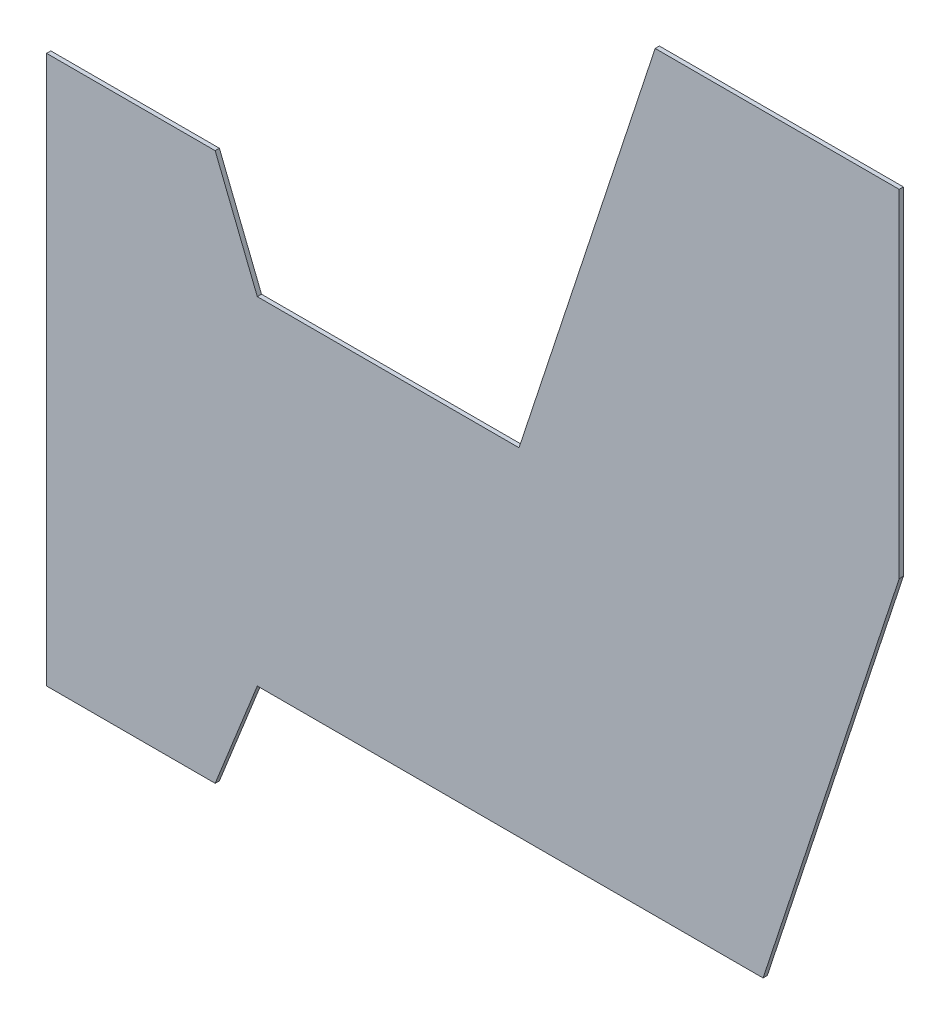
ISO-10303-21;
HEADER;
FILE_DESCRIPTION(('STEP AP214'),'2;1');
FILE_NAME('part.step','',(''),(''),'','','');
FILE_SCHEMA(('AUTOMOTIVE_DESIGN { 1 0 10303 214 1 1 1 1 }'));
ENDSEC;
DATA;
#1=APPLICATION_CONTEXT('core data for automotive mechanical design processes');
#2=APPLICATION_PROTOCOL_DEFINITION('international standard','automotive_design',2000,#1);
#3=PRODUCT_CONTEXT('',#1,'mechanical');
#4=PRODUCT('Part','Part','',(#3));
#5=PRODUCT_RELATED_PRODUCT_CATEGORY('part','',(#4));
#6=PRODUCT_DEFINITION_FORMATION('','',#4);
#7=PRODUCT_DEFINITION_CONTEXT('part definition',#1,'design');
#8=PRODUCT_DEFINITION('design','',#6,#7);
#9=PRODUCT_DEFINITION_SHAPE('','',#8);
#10=(LENGTH_UNIT() NAMED_UNIT(*) SI_UNIT(.MILLI.,.METRE.));
#11=(NAMED_UNIT(*) PLANE_ANGLE_UNIT() SI_UNIT($,.RADIAN.));
#12=(NAMED_UNIT(*) SI_UNIT($,.STERADIAN.) SOLID_ANGLE_UNIT());
#13=UNCERTAINTY_MEASURE_WITH_UNIT(LENGTH_MEASURE(1.E-05),#10,'distance_accuracy_value','');
#14=(GEOMETRIC_REPRESENTATION_CONTEXT(3) GLOBAL_UNCERTAINTY_ASSIGNED_CONTEXT((#13)) GLOBAL_UNIT_ASSIGNED_CONTEXT((#10,
#11,#12)) REPRESENTATION_CONTEXT('',''));
#15=CARTESIAN_POINT('',(0.,0.,0.));
#16=DIRECTION('',(0.,0.,1.));
#17=DIRECTION('',(1.,0.,0.));
#18=AXIS2_PLACEMENT_3D('',#15,#16,#17);
#19=CARTESIAN_POINT('',(0.,0.,2.54));
#20=DIRECTION('',(0.,1.,0.));
#21=DIRECTION('',(0.,0.,1.));
#22=AXIS2_PLACEMENT_3D('',#19,#20,#21);
#23=PLANE('',#22);
#24=DIRECTION('',(1.,0.,0.));
#25=VECTOR('',#24,1.);
#26=CARTESIAN_POINT('',(0.,0.,0.));
#27=LINE('',#26,#25);
#28=CARTESIAN_POINT('',(0.,0.,0.));
#29=VERTEX_POINT('',#28);
#30=CARTESIAN_POINT('',(101.6,0.,0.));
#31=VERTEX_POINT('',#30);
#32=EDGE_CURVE('E158',#29,#31,#27,.T.);
#33=ORIENTED_EDGE('',*,*,#32,.T.);
#34=DIRECTION('',(0.,0.,-1.));
#35=VECTOR('',#34,1.);
#36=CARTESIAN_POINT('',(101.6,0.,2.54));
#37=LINE('',#36,#35);
#38=CARTESIAN_POINT('',(101.6,0.,2.54));
#39=VERTEX_POINT('',#38);
#40=EDGE_CURVE('E11',#39,#31,#37,.T.);
#41=ORIENTED_EDGE('',*,*,#40,.F.);
#42=DIRECTION('',(1.,0.,0.));
#43=VECTOR('',#42,1.);
#44=CARTESIAN_POINT('',(0.,0.,2.54));
#45=LINE('',#44,#43);
#46=CARTESIAN_POINT('',(0.,0.,2.54));
#47=VERTEX_POINT('',#46);
#48=EDGE_CURVE('E189',#47,#39,#45,.T.);
#49=ORIENTED_EDGE('',*,*,#48,.F.);
#50=DIRECTION('',(0.,0.,-1.));
#51=VECTOR('',#50,1.);
#52=CARTESIAN_POINT('',(0.,0.,2.54));
#53=LINE('',#52,#51);
#54=EDGE_CURVE('E154',#47,#29,#53,.T.);
#55=ORIENTED_EDGE('',*,*,#54,.T.);
#56=EDGE_LOOP('',(#33,#41,#49,#55));
#57=FACE_BOUND('',#56,.T.);
#58=ADVANCED_FACE('F39',(#57),#23,.F.);
#59=CARTESIAN_POINT('',(101.6,0.,2.54));
#60=DIRECTION('',(-0.928476690885411,0.371390676353725,0.));
#61=DIRECTION('',(-0.371390676353725,-0.928476690885411,0.));
#62=AXIS2_PLACEMENT_3D('',#59,#60,#61);
#63=PLANE('',#62);
#64=DIRECTION('',(0.371390676353725,0.928476690885411,0.));
#65=VECTOR('',#64,1.);
#66=CARTESIAN_POINT('',(101.6,0.,0.));
#67=LINE('',#66,#65);
#68=CARTESIAN_POINT('',(127.,63.5000000000751,0.));
#69=VERTEX_POINT('',#68);
#70=EDGE_CURVE('E162',#31,#69,#67,.T.);
#71=ORIENTED_EDGE('',*,*,#70,.T.);
#72=DIRECTION('',(0.,0.,-1.));
#73=VECTOR('',#72,1.);
#74=CARTESIAN_POINT('',(127.,63.5000000000751,2.54));
#75=LINE('',#74,#73);
#76=CARTESIAN_POINT('',(127.,63.5000000000751,2.54));
#77=VERTEX_POINT('',#76);
#78=EDGE_CURVE('E48',#77,#69,#75,.T.);
#79=ORIENTED_EDGE('',*,*,#78,.F.);
#80=DIRECTION('',(0.371390676353725,0.928476690885411,0.));
#81=VECTOR('',#80,1.);
#82=CARTESIAN_POINT('',(101.6,0.,2.54));
#83=LINE('',#82,#81);
#84=EDGE_CURVE('E108',#39,#77,#83,.T.);
#85=ORIENTED_EDGE('',*,*,#84,.F.);
#86=ORIENTED_EDGE('',*,*,#40,.T.);
#87=EDGE_LOOP('',(#71,#79,#85,#86));
#88=FACE_BOUND('',#87,.T.);
#89=ADVANCED_FACE('F275',(#88),#63,.F.);
#90=CARTESIAN_POINT('',(127.,63.5000000000751,2.54));
#91=DIRECTION('',(0.,1.,0.));
#92=DIRECTION('',(0.,0.,1.));
#93=AXIS2_PLACEMENT_3D('',#90,#91,#92);
#94=PLANE('',#93);
#95=DIRECTION('',(1.,0.,0.));
#96=VECTOR('',#95,1.);
#97=CARTESIAN_POINT('',(127.,63.5000000000751,0.));
#98=LINE('',#97,#96);
#99=CARTESIAN_POINT('',(431.8,63.5000000000751,0.));
#100=VERTEX_POINT('',#99);
#101=EDGE_CURVE('E165',#69,#100,#98,.T.);
#102=ORIENTED_EDGE('',*,*,#101,.T.);
#103=DIRECTION('',(0.,0.,-1.));
#104=VECTOR('',#103,1.);
#105=CARTESIAN_POINT('',(431.8,63.5000000000751,2.54));
#106=LINE('',#105,#104);
#107=CARTESIAN_POINT('',(431.8,63.5000000000751,2.54));
#108=VERTEX_POINT('',#107);
#109=EDGE_CURVE('E212',#108,#100,#106,.T.);
#110=ORIENTED_EDGE('',*,*,#109,.F.);
#111=DIRECTION('',(1.,0.,0.));
#112=VECTOR('',#111,1.);
#113=CARTESIAN_POINT('',(127.,63.5000000000751,2.54));
#114=LINE('',#113,#112);
#115=EDGE_CURVE('E222',#77,#108,#114,.T.);
#116=ORIENTED_EDGE('',*,*,#115,.F.);
#117=ORIENTED_EDGE('',*,*,#78,.T.);
#118=EDGE_LOOP('',(#102,#110,#116,#117));
#119=FACE_BOUND('',#118,.T.);
#120=ADVANCED_FACE('F220',(#119),#94,.F.);
#121=CARTESIAN_POINT('',(431.8,63.5000000000751,2.54));
#122=DIRECTION('',(-0.949935403796192,0.312446361179908,0.));
#123=DIRECTION('',(-0.312446361179908,-0.949935403796192,0.));
#124=AXIS2_PLACEMENT_3D('',#121,#122,#123);
#125=PLANE('',#124);
#126=DIRECTION('',(0.312446361179908,0.949935403796192,0.));
#127=VECTOR('',#126,1.);
#128=CARTESIAN_POINT('',(431.8,63.5000000000751,0.));
#129=LINE('',#128,#127);
#130=CARTESIAN_POINT('',(513.84017943214,312.928000000075,0.));
#131=VERTEX_POINT('',#130);
#132=EDGE_CURVE('E168',#100,#131,#129,.T.);
#133=ORIENTED_EDGE('',*,*,#132,.T.);
#134=DIRECTION('',(0.,0.,-1.));
#135=VECTOR('',#134,1.);
#136=CARTESIAN_POINT('',(513.84017943214,312.928000000075,2.54));
#137=LINE('',#136,#135);
#138=CARTESIAN_POINT('',(513.84017943214,312.928000000075,2.54));
#139=VERTEX_POINT('',#138);
#140=EDGE_CURVE('E208',#139,#131,#137,.T.);
#141=ORIENTED_EDGE('',*,*,#140,.F.);
#142=DIRECTION('',(0.312446361179908,0.949935403796192,0.));
#143=VECTOR('',#142,1.);
#144=CARTESIAN_POINT('',(431.8,63.5000000000751,2.54));
#145=LINE('',#144,#143);
#146=EDGE_CURVE('E241',#108,#139,#145,.T.);
#147=ORIENTED_EDGE('',*,*,#146,.F.);
#148=ORIENTED_EDGE('',*,*,#109,.T.);
#149=EDGE_LOOP('',(#133,#141,#147,#148));
#150=FACE_BOUND('',#149,.T.);
#151=ADVANCED_FACE('F231',(#150),#125,.F.);
#152=CARTESIAN_POINT('',(513.84017943214,516.128000000075,2.54));
#153=DIRECTION('',(-1.,0.,0.));
#154=DIRECTION('',(0.,-1.,0.));
#155=AXIS2_PLACEMENT_3D('',#152,#153,#154);
#156=PLANE('',#155);
#157=DIRECTION('',(0.,1.,0.));
#158=VECTOR('',#157,1.);
#159=CARTESIAN_POINT('',(513.84017943214,516.128000000075,0.));
#160=LINE('',#159,#158);
#161=CARTESIAN_POINT('',(513.84017943214,516.128000000075,0.));
#162=VERTEX_POINT('',#161);
#163=EDGE_CURVE('E171',#131,#162,#160,.T.);
#164=ORIENTED_EDGE('',*,*,#163,.T.);
#165=DIRECTION('',(0.,0.,-1.));
#166=VECTOR('',#165,1.);
#167=CARTESIAN_POINT('',(513.84017943214,516.128000000075,2.54));
#168=LINE('',#167,#166);
#169=CARTESIAN_POINT('',(513.84017943214,516.128000000075,2.54));
#170=VERTEX_POINT('',#169);
#171=EDGE_CURVE('E204',#170,#162,#168,.T.);
#172=ORIENTED_EDGE('',*,*,#171,.F.);
#173=DIRECTION('',(0.,1.,0.));
#174=VECTOR('',#173,1.);
#175=CARTESIAN_POINT('',(513.84017943214,516.128000000075,2.54));
#176=LINE('',#175,#174);
#177=EDGE_CURVE('E237',#139,#170,#176,.T.);
#178=ORIENTED_EDGE('',*,*,#177,.F.);
#179=ORIENTED_EDGE('',*,*,#140,.T.);
#180=EDGE_LOOP('',(#164,#172,#178,#179));
#181=FACE_BOUND('',#180,.T.);
#182=ADVANCED_FACE('F235',(#181),#156,.F.);
#183=CARTESIAN_POINT('',(366.766074340445,516.128000000075,2.54));
#184=DIRECTION('',(0.,-1.,0.));
#185=DIRECTION('',(0.,0.,-1.));
#186=AXIS2_PLACEMENT_3D('',#183,#184,#185);
#187=PLANE('',#186);
#188=DIRECTION('',(-1.,0.,0.));
#189=VECTOR('',#188,1.);
#190=CARTESIAN_POINT('',(366.766074340445,516.128000000075,0.));
#191=LINE('',#190,#189);
#192=CARTESIAN_POINT('',(366.766074340445,516.128000000075,0.));
#193=VERTEX_POINT('',#192);
#194=EDGE_CURVE('E174',#162,#193,#191,.T.);
#195=ORIENTED_EDGE('',*,*,#194,.T.);
#196=DIRECTION('',(0.,0.,-1.));
#197=VECTOR('',#196,1.);
#198=CARTESIAN_POINT('',(366.766074340445,516.128000000075,2.54));
#199=LINE('',#198,#197);
#200=CARTESIAN_POINT('',(366.766074340445,516.128000000075,2.54));
#201=VERTEX_POINT('',#200);
#202=EDGE_CURVE('E200',#201,#193,#199,.T.);
#203=ORIENTED_EDGE('',*,*,#202,.F.);
#204=DIRECTION('',(-1.,0.,0.));
#205=VECTOR('',#204,1.);
#206=CARTESIAN_POINT('',(366.766074340445,516.128000000075,2.54));
#207=LINE('',#206,#205);
#208=EDGE_CURVE('E240',#170,#201,#207,.T.);
#209=ORIENTED_EDGE('',*,*,#208,.F.);
#210=ORIENTED_EDGE('',*,*,#171,.T.);
#211=EDGE_LOOP('',(#195,#203,#209,#210));
#212=FACE_BOUND('',#211,.T.);
#213=ADVANCED_FACE('F288',(#212),#187,.F.);
#214=CARTESIAN_POINT('',(284.725894908256,266.699999999925,2.54));
#215=DIRECTION('',(0.949935403796192,-0.312446361179908,0.));
#216=DIRECTION('',(0.312446361179908,0.949935403796192,0.));
#217=AXIS2_PLACEMENT_3D('',#214,#215,#216);
#218=PLANE('',#217);
#219=DIRECTION('',(-0.312446361179908,-0.949935403796192,0.));
#220=VECTOR('',#219,1.);
#221=CARTESIAN_POINT('',(284.725894908256,266.699999999925,0.));
#222=LINE('',#221,#220);
#223=CARTESIAN_POINT('',(284.725894908256,266.699999999925,0.));
#224=VERTEX_POINT('',#223);
#225=EDGE_CURVE('E177',#193,#224,#222,.T.);
#226=ORIENTED_EDGE('',*,*,#225,.T.);
#227=DIRECTION('',(0.,0.,-1.));
#228=VECTOR('',#227,1.);
#229=CARTESIAN_POINT('',(284.725894908256,266.699999999925,2.54));
#230=LINE('',#229,#228);
#231=CARTESIAN_POINT('',(284.725894908256,266.699999999925,2.54));
#232=VERTEX_POINT('',#231);
#233=EDGE_CURVE('E196',#232,#224,#230,.T.);
#234=ORIENTED_EDGE('',*,*,#233,.F.);
#235=DIRECTION('',(-0.312446361179908,-0.949935403796192,0.));
#236=VECTOR('',#235,1.);
#237=CARTESIAN_POINT('',(284.725894908256,266.699999999925,2.54));
#238=LINE('',#237,#236);
#239=EDGE_CURVE('E245',#201,#232,#238,.T.);
#240=ORIENTED_EDGE('',*,*,#239,.F.);
#241=ORIENTED_EDGE('',*,*,#202,.T.);
#242=EDGE_LOOP('',(#226,#234,#240,#241));
#243=FACE_BOUND('',#242,.T.);
#244=ADVANCED_FACE('F256',(#243),#218,.F.);
#245=CARTESIAN_POINT('',(127.,266.699999999925,2.54));
#246=DIRECTION('',(0.,-1.,0.));
#247=DIRECTION('',(0.,0.,-1.));
#248=AXIS2_PLACEMENT_3D('',#245,#246,#247);
#249=PLANE('',#248);
#250=DIRECTION('',(-1.,0.,0.));
#251=VECTOR('',#250,1.);
#252=CARTESIAN_POINT('',(127.,266.699999999925,0.));
#253=LINE('',#252,#251);
#254=CARTESIAN_POINT('',(127.,266.699999999925,0.));
#255=VERTEX_POINT('',#254);
#256=EDGE_CURVE('E180',#224,#255,#253,.T.);
#257=ORIENTED_EDGE('',*,*,#256,.T.);
#258=DIRECTION('',(0.,0.,-1.));
#259=VECTOR('',#258,1.);
#260=CARTESIAN_POINT('',(127.,266.699999999925,2.54));
#261=LINE('',#260,#259);
#262=CARTESIAN_POINT('',(127.,266.699999999925,2.54));
#263=VERTEX_POINT('',#262);
#264=EDGE_CURVE('E147',#263,#255,#261,.T.);
#265=ORIENTED_EDGE('',*,*,#264,.F.);
#266=DIRECTION('',(-1.,0.,0.));
#267=VECTOR('',#266,1.);
#268=CARTESIAN_POINT('',(127.,266.699999999925,2.54));
#269=LINE('',#268,#267);
#270=EDGE_CURVE('E136',#232,#263,#269,.T.);
#271=ORIENTED_EDGE('',*,*,#270,.F.);
#272=ORIENTED_EDGE('',*,*,#233,.T.);
#273=EDGE_LOOP('',(#257,#265,#271,#272));
#274=FACE_BOUND('',#273,.T.);
#275=ADVANCED_FACE('F260',(#274),#249,.F.);
#276=CARTESIAN_POINT('',(101.6,330.2,2.54));
#277=DIRECTION('',(-0.928476690885411,-0.371390676353724,0.));
#278=DIRECTION('',(0.371390676353725,-0.928476690885411,0.));
#279=AXIS2_PLACEMENT_3D('',#276,#277,#278);
#280=PLANE('',#279);
#281=DIRECTION('',(-0.371390676353724,0.928476690885411,0.));
#282=VECTOR('',#281,1.);
#283=CARTESIAN_POINT('',(101.6,330.2,0.));
#284=LINE('',#283,#282);
#285=CARTESIAN_POINT('',(101.6,330.2,0.));
#286=VERTEX_POINT('',#285);
#287=EDGE_CURVE('E145',#255,#286,#284,.T.);
#288=ORIENTED_EDGE('',*,*,#287,.T.);
#289=DIRECTION('',(0.,0.,-1.));
#290=VECTOR('',#289,1.);
#291=CARTESIAN_POINT('',(101.6,330.2,2.54));
#292=LINE('',#291,#290);
#293=CARTESIAN_POINT('',(101.6,330.2,2.54));
#294=VERTEX_POINT('',#293);
#295=EDGE_CURVE('E142',#294,#286,#292,.T.);
#296=ORIENTED_EDGE('',*,*,#295,.F.);
#297=DIRECTION('',(-0.371390676353724,0.928476690885411,0.));
#298=VECTOR('',#297,1.);
#299=CARTESIAN_POINT('',(101.6,330.2,2.54));
#300=LINE('',#299,#298);
#301=EDGE_CURVE('E130',#263,#294,#300,.T.);
#302=ORIENTED_EDGE('',*,*,#301,.F.);
#303=ORIENTED_EDGE('',*,*,#264,.T.);
#304=EDGE_LOOP('',(#288,#296,#302,#303));
#305=FACE_BOUND('',#304,.T.);
#306=ADVANCED_FACE('F143',(#305),#280,.F.);
#307=CARTESIAN_POINT('',(0.,330.2,2.54));
#308=DIRECTION('',(0.,-1.,0.));
#309=DIRECTION('',(0.,0.,-1.));
#310=AXIS2_PLACEMENT_3D('',#307,#308,#309);
#311=PLANE('',#310);
#312=DIRECTION('',(-1.,0.,0.));
#313=VECTOR('',#312,1.);
#314=CARTESIAN_POINT('',(0.,330.2,0.));
#315=LINE('',#314,#313);
#316=CARTESIAN_POINT('',(0.,330.2,0.));
#317=VERTEX_POINT('',#316);
#318=EDGE_CURVE('E94',#286,#317,#315,.T.);
#319=ORIENTED_EDGE('',*,*,#318,.T.);
#320=DIRECTION('',(0.,0.,-1.));
#321=VECTOR('',#320,1.);
#322=CARTESIAN_POINT('',(0.,330.2,2.54));
#323=LINE('',#322,#321);
#324=CARTESIAN_POINT('',(0.,330.2,2.54));
#325=VERTEX_POINT('',#324);
#326=EDGE_CURVE('E148',#325,#317,#323,.T.);
#327=ORIENTED_EDGE('',*,*,#326,.F.);
#328=DIRECTION('',(-1.,0.,0.));
#329=VECTOR('',#328,1.);
#330=CARTESIAN_POINT('',(0.,330.2,2.54));
#331=LINE('',#330,#329);
#332=EDGE_CURVE('E134',#294,#325,#331,.T.);
#333=ORIENTED_EDGE('',*,*,#332,.F.);
#334=ORIENTED_EDGE('',*,*,#295,.T.);
#335=EDGE_LOOP('',(#319,#327,#333,#334));
#336=FACE_BOUND('',#335,.T.);
#337=ADVANCED_FACE('F150',(#336),#311,.F.);
#338=CARTESIAN_POINT('',(0.,0.,2.54));
#339=DIRECTION('',(1.,0.,0.));
#340=DIRECTION('',(0.,0.,-1.));
#341=AXIS2_PLACEMENT_3D('',#338,#339,#340);
#342=PLANE('',#341);
#343=DIRECTION('',(0.,-1.,0.));
#344=VECTOR('',#343,1.);
#345=CARTESIAN_POINT('',(0.,0.,0.));
#346=LINE('',#345,#344);
#347=EDGE_CURVE('E100',#317,#29,#346,.T.);
#348=ORIENTED_EDGE('',*,*,#347,.T.);
#349=ORIENTED_EDGE('',*,*,#54,.F.);
#350=DIRECTION('',(0.,-1.,0.));
#351=VECTOR('',#350,1.);
#352=CARTESIAN_POINT('',(0.,0.,2.54));
#353=LINE('',#352,#351);
#354=EDGE_CURVE('E56',#325,#47,#353,.T.);
#355=ORIENTED_EDGE('',*,*,#354,.F.);
#356=ORIENTED_EDGE('',*,*,#326,.T.);
#357=EDGE_LOOP('',(#348,#349,#355,#356));
#358=FACE_BOUND('',#357,.T.);
#359=ADVANCED_FACE('F264',(#358),#342,.F.);
#360=CARTESIAN_POINT('',(0.,0.,2.54));
#361=DIRECTION('',(0.,0.,-1.));
#362=DIRECTION('',(-1.,0.,0.));
#363=AXIS2_PLACEMENT_3D('',#360,#361,#362);
#364=PLANE('',#363);
#365=ORIENTED_EDGE('',*,*,#48,.T.);
#366=ORIENTED_EDGE('',*,*,#84,.T.);
#367=ORIENTED_EDGE('',*,*,#115,.T.);
#368=ORIENTED_EDGE('',*,*,#146,.T.);
#369=ORIENTED_EDGE('',*,*,#177,.T.);
#370=ORIENTED_EDGE('',*,*,#208,.T.);
#371=ORIENTED_EDGE('',*,*,#239,.T.);
#372=ORIENTED_EDGE('',*,*,#270,.T.);
#373=ORIENTED_EDGE('',*,*,#301,.T.);
#374=ORIENTED_EDGE('',*,*,#332,.T.);
#375=ORIENTED_EDGE('',*,*,#354,.T.);
#376=EDGE_LOOP('',(#365,#366,#367,#368,#369,#370,#371,#372,#373,#374,#375));
#377=FACE_BOUND('',#376,.T.);
#378=ADVANCED_FACE('F132',(#377),#364,.F.);
#379=CARTESIAN_POINT('',(0.,0.,0.));
#380=DIRECTION('',(0.,0.,-1.));
#381=DIRECTION('',(-1.,0.,0.));
#382=AXIS2_PLACEMENT_3D('',#379,#380,#381);
#383=PLANE('',#382);
#384=ORIENTED_EDGE('',*,*,#32,.F.);
#385=ORIENTED_EDGE('',*,*,#347,.F.);
#386=ORIENTED_EDGE('',*,*,#318,.F.);
#387=ORIENTED_EDGE('',*,*,#287,.F.);
#388=ORIENTED_EDGE('',*,*,#256,.F.);
#389=ORIENTED_EDGE('',*,*,#225,.F.);
#390=ORIENTED_EDGE('',*,*,#194,.F.);
#391=ORIENTED_EDGE('',*,*,#163,.F.);
#392=ORIENTED_EDGE('',*,*,#132,.F.);
#393=ORIENTED_EDGE('',*,*,#101,.F.);
#394=ORIENTED_EDGE('',*,*,#70,.F.);
#395=EDGE_LOOP('',(#384,#385,#386,#387,#388,#389,#390,#391,#392,#393,#394));
#396=FACE_BOUND('',#395,.T.);
#397=ADVANCED_FACE('F226',(#396),#383,.T.);
#398=CLOSED_SHELL('',(#58,#89,#120,#151,#182,#213,#244,#275,#306,#337,#359,#378,#397));
#399=MANIFOLD_SOLID_BREP('B2',#398);
#400=ADVANCED_BREP_SHAPE_REPRESENTATION('',(#18,#399),#14);
#401=SHAPE_DEFINITION_REPRESENTATION(#9,#400);
ENDSEC;
END-ISO-10303-21;
